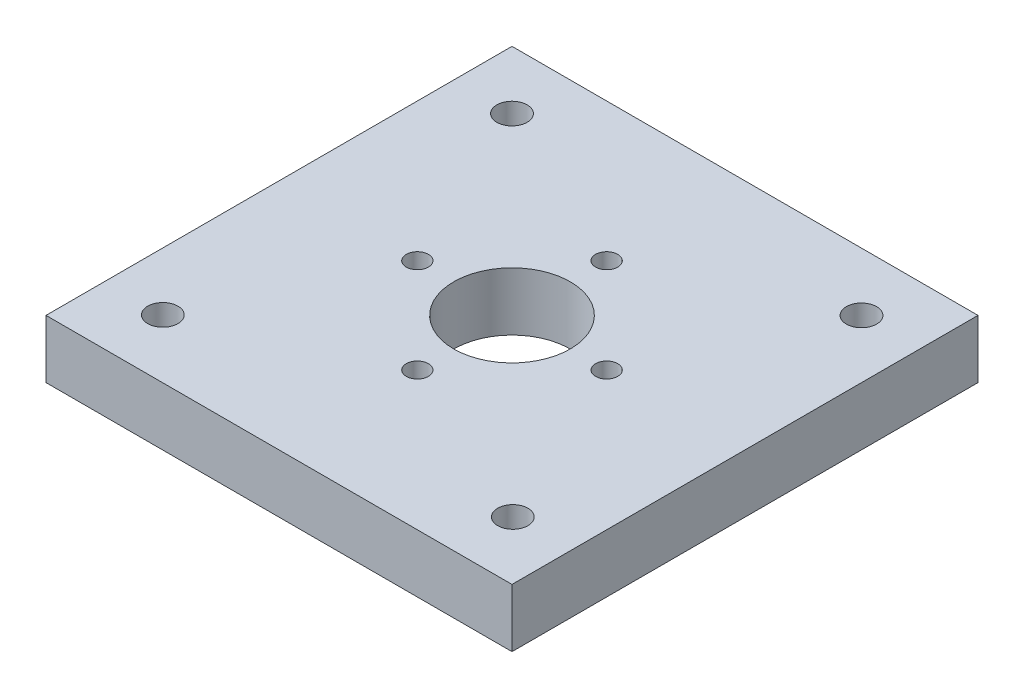
ISO-10303-21;
HEADER;
FILE_DESCRIPTION(('STEP AP214'),'2;1');
FILE_NAME('part.step','',(''),(''),'','','');
FILE_SCHEMA(('AUTOMOTIVE_DESIGN { 1 0 10303 214 1 1 1 1 }'));
ENDSEC;
DATA;
#1=APPLICATION_CONTEXT('core data for automotive mechanical design processes');
#2=APPLICATION_PROTOCOL_DEFINITION('international standard','automotive_design',2000,#1);
#3=PRODUCT_CONTEXT('',#1,'mechanical');
#4=PRODUCT('Part','Part','',(#3));
#5=PRODUCT_RELATED_PRODUCT_CATEGORY('part','',(#4));
#6=PRODUCT_DEFINITION_FORMATION('','',#4);
#7=PRODUCT_DEFINITION_CONTEXT('part definition',#1,'design');
#8=PRODUCT_DEFINITION('design','',#6,#7);
#9=PRODUCT_DEFINITION_SHAPE('','',#8);
#10=(LENGTH_UNIT() NAMED_UNIT(*) SI_UNIT(.MILLI.,.METRE.));
#11=(NAMED_UNIT(*) PLANE_ANGLE_UNIT() SI_UNIT($,.RADIAN.));
#12=(NAMED_UNIT(*) SI_UNIT($,.STERADIAN.) SOLID_ANGLE_UNIT());
#13=UNCERTAINTY_MEASURE_WITH_UNIT(LENGTH_MEASURE(1.E-05),#10,'distance_accuracy_value','');
#14=(GEOMETRIC_REPRESENTATION_CONTEXT(3) GLOBAL_UNCERTAINTY_ASSIGNED_CONTEXT((#13)) GLOBAL_UNIT_ASSIGNED_CONTEXT((#10,
#11,#12)) REPRESENTATION_CONTEXT('',''));
#15=CARTESIAN_POINT('',(0.,0.,0.));
#16=DIRECTION('',(0.,0.,1.));
#17=DIRECTION('',(1.,0.,0.));
#18=AXIS2_PLACEMENT_3D('',#15,#16,#17);
#19=CARTESIAN_POINT('',(0.,12.7,0.));
#20=DIRECTION('',(0.,1.,0.));
#21=DIRECTION('',(0.,0.,1.));
#22=AXIS2_PLACEMENT_3D('',#19,#20,#21);
#23=PLANE('',#22);
#24=CARTESIAN_POINT('',(5.84923411699841E-13,12.7,-20.6374999999994));
#25=DIRECTION('',(0.,1.,0.));
#26=DIRECTION('',(0.,0.,1.));
#27=AXIS2_PLACEMENT_3D('',#24,#25,#26);
#28=CIRCLE('',#27,2.41299999999961);
#29=CARTESIAN_POINT('',(5.84923411699841E-13,12.7,-18.2244999999998));
#30=VERTEX_POINT('',#29);
#31=EDGE_CURVE('E134',#30,#30,#28,.T.);
#32=ORIENTED_EDGE('',*,*,#31,.F.);
#33=EDGE_LOOP('',(#32));
#34=FACE_BOUND('',#33,.T.);
#35=CARTESIAN_POINT('',(20.6375000000006,12.7,5.85289345954093E-13));
#36=DIRECTION('',(0.,1.,0.));
#37=DIRECTION('',(0.,0.,1.));
#38=AXIS2_PLACEMENT_3D('',#35,#36,#37);
#39=CIRCLE('',#38,2.41299999999934);
#40=CARTESIAN_POINT('',(20.6375000000006,12.7,2.41299999999993));
#41=VERTEX_POINT('',#40);
#42=EDGE_CURVE('E263',#41,#41,#39,.T.);
#43=ORIENTED_EDGE('',*,*,#42,.F.);
#44=EDGE_LOOP('',(#43));
#45=FACE_BOUND('',#44,.T.);
#46=CARTESIAN_POINT('',(5.7986868203636E-13,12.7,20.6375000000006));
#47=DIRECTION('',(0.,1.,0.));
#48=DIRECTION('',(0.,0.,1.));
#49=AXIS2_PLACEMENT_3D('',#46,#47,#48);
#50=CIRCLE('',#49,2.41300000000052);
#51=CARTESIAN_POINT('',(5.7986868203636E-13,12.7,23.0505000000011));
#52=VERTEX_POINT('',#51);
#53=EDGE_CURVE('E267',#52,#52,#50,.T.);
#54=ORIENTED_EDGE('',*,*,#53,.F.);
#55=EDGE_LOOP('',(#54));
#56=FACE_BOUND('',#55,.T.);
#57=CARTESIAN_POINT('',(-20.6374999999994,12.7,5.85289345954092E-13));
#58=DIRECTION('',(0.,1.,0.));
#59=DIRECTION('',(0.,0.,1.));
#60=AXIS2_PLACEMENT_3D('',#57,#58,#59);
#61=CIRCLE('',#60,2.41300000000094);
#62=CARTESIAN_POINT('',(-20.6374999999994,12.7,2.41300000000152));
#63=VERTEX_POINT('',#62);
#64=EDGE_CURVE('E272',#63,#63,#61,.T.);
#65=ORIENTED_EDGE('',*,*,#64,.F.);
#66=EDGE_LOOP('',(#65));
#67=FACE_BOUND('',#66,.T.);
#68=CARTESIAN_POINT('',(0.,12.7,0.));
#69=DIRECTION('',(0.,1.,0.));
#70=DIRECTION('',(0.,0.,1.));
#71=AXIS2_PLACEMENT_3D('',#68,#69,#70);
#72=CIRCLE('',#71,12.7);
#73=CARTESIAN_POINT('',(0.,12.7,12.7));
#74=VERTEX_POINT('',#73);
#75=EDGE_CURVE('E144',#74,#74,#72,.T.);
#76=ORIENTED_EDGE('',*,*,#75,.F.);
#77=EDGE_LOOP('',(#76));
#78=FACE_BOUND('',#77,.T.);
#79=CARTESIAN_POINT('',(-38.1548462803196,12.7,37.9717700831118));
#80=DIRECTION('',(0.,-1.,0.));
#81=DIRECTION('',(0.,0.,-1.));
#82=AXIS2_PLACEMENT_3D('',#79,#80,#81);
#83=CIRCLE('',#82,3.302);
#84=CARTESIAN_POINT('',(-38.1548462803196,12.7,34.6697700831119));
#85=VERTEX_POINT('',#84);
#86=EDGE_CURVE('E168',#85,#85,#83,.T.);
#87=ORIENTED_EDGE('',*,*,#86,.T.);
#88=EDGE_LOOP('',(#87));
#89=FACE_BOUND('',#88,.T.);
#90=CARTESIAN_POINT('',(38.1548462803196,12.7,37.9717700831118));
#91=DIRECTION('',(0.,1.,0.));
#92=DIRECTION('',(0.,0.,1.));
#93=AXIS2_PLACEMENT_3D('',#90,#91,#92);
#94=CIRCLE('',#93,3.302);
#95=CARTESIAN_POINT('',(38.1548462803196,12.7,41.2737700831118));
#96=VERTEX_POINT('',#95);
#97=EDGE_CURVE('E159',#96,#96,#94,.T.);
#98=ORIENTED_EDGE('',*,*,#97,.F.);
#99=EDGE_LOOP('',(#98));
#100=FACE_BOUND('',#99,.T.);
#101=CARTESIAN_POINT('',(-38.1,12.7,-38.1));
#102=DIRECTION('',(0.,1.,0.));
#103=DIRECTION('',(0.,0.,1.));
#104=AXIS2_PLACEMENT_3D('',#101,#102,#103);
#105=CIRCLE('',#104,3.302);
#106=CARTESIAN_POINT('',(-38.1,12.7,-34.798));
#107=VERTEX_POINT('',#106);
#108=EDGE_CURVE('E163',#107,#107,#105,.T.);
#109=ORIENTED_EDGE('',*,*,#108,.F.);
#110=EDGE_LOOP('',(#109));
#111=FACE_BOUND('',#110,.T.);
#112=DIRECTION('',(0.,0.,-1.));
#113=VECTOR('',#112,1.);
#114=CARTESIAN_POINT('',(50.8,12.7,-50.8));
#115=LINE('',#114,#113);
#116=CARTESIAN_POINT('',(50.8,12.7,50.8));
#117=VERTEX_POINT('',#116);
#118=CARTESIAN_POINT('',(50.8,12.7,-50.8));
#119=VERTEX_POINT('',#118);
#120=EDGE_CURVE('E97',#117,#119,#115,.T.);
#121=ORIENTED_EDGE('',*,*,#120,.T.);
#122=DIRECTION('',(-1.,0.,0.));
#123=VECTOR('',#122,1.);
#124=CARTESIAN_POINT('',(-50.8,12.7,-50.8));
#125=LINE('',#124,#123);
#126=CARTESIAN_POINT('',(-50.8,12.7,-50.8));
#127=VERTEX_POINT('',#126);
#128=EDGE_CURVE('E92',#119,#127,#125,.T.);
#129=ORIENTED_EDGE('',*,*,#128,.T.);
#130=DIRECTION('',(0.,0.,1.));
#131=VECTOR('',#130,1.);
#132=CARTESIAN_POINT('',(-50.8,12.7,-50.8));
#133=LINE('',#132,#131);
#134=CARTESIAN_POINT('',(-50.8,12.7,50.8));
#135=VERTEX_POINT('',#134);
#136=EDGE_CURVE('E95',#127,#135,#133,.T.);
#137=ORIENTED_EDGE('',*,*,#136,.T.);
#138=DIRECTION('',(1.,0.,0.));
#139=VECTOR('',#138,1.);
#140=CARTESIAN_POINT('',(-50.8,12.7,50.8));
#141=LINE('',#140,#139);
#142=EDGE_CURVE('E62',#135,#117,#141,.T.);
#143=ORIENTED_EDGE('',*,*,#142,.T.);
#144=EDGE_LOOP('',(#121,#129,#137,#143));
#145=FACE_BOUND('',#144,.T.);
#146=CARTESIAN_POINT('',(38.1,12.7,-38.0999999999999));
#147=DIRECTION('',(0.,-1.,0.));
#148=DIRECTION('',(0.,0.,-1.));
#149=AXIS2_PLACEMENT_3D('',#146,#147,#148);
#150=CIRCLE('',#149,3.302);
#151=CARTESIAN_POINT('',(38.1,12.7,-41.4019999999999));
#152=VERTEX_POINT('',#151);
#153=EDGE_CURVE('E176',#152,#152,#150,.T.);
#154=ORIENTED_EDGE('',*,*,#153,.T.);
#155=EDGE_LOOP('',(#154));
#156=FACE_BOUND('',#155,.T.);
#157=ADVANCED_FACE('F42',(#34,#45,#56,#67,#78,#89,#100,#111,#145,#156),#23,.T.);
#158=CARTESIAN_POINT('',(0.,0.,0.));
#159=DIRECTION('',(0.,1.,0.));
#160=DIRECTION('',(0.,0.,1.));
#161=AXIS2_PLACEMENT_3D('',#158,#159,#160);
#162=PLANE('',#161);
#163=CARTESIAN_POINT('',(5.84923411699841E-13,0.,-20.6374999999994));
#164=DIRECTION('',(0.,1.,0.));
#165=DIRECTION('',(0.,0.,1.));
#166=AXIS2_PLACEMENT_3D('',#163,#164,#165);
#167=CIRCLE('',#166,2.41299999999961);
#168=CARTESIAN_POINT('',(5.84923411699841E-13,0.,-18.2244999999998));
#169=VERTEX_POINT('',#168);
#170=EDGE_CURVE('E46',#169,#169,#167,.T.);
#171=ORIENTED_EDGE('',*,*,#170,.T.);
#172=EDGE_LOOP('',(#171));
#173=FACE_BOUND('',#172,.T.);
#174=CARTESIAN_POINT('',(20.6375000000006,0.,5.85289345954093E-13));
#175=DIRECTION('',(0.,1.,0.));
#176=DIRECTION('',(0.,0.,1.));
#177=AXIS2_PLACEMENT_3D('',#174,#175,#176);
#178=CIRCLE('',#177,2.41299999999934);
#179=CARTESIAN_POINT('',(20.6375000000006,0.,2.41299999999993));
#180=VERTEX_POINT('',#179);
#181=EDGE_CURVE('E137',#180,#180,#178,.T.);
#182=ORIENTED_EDGE('',*,*,#181,.T.);
#183=EDGE_LOOP('',(#182));
#184=FACE_BOUND('',#183,.T.);
#185=CARTESIAN_POINT('',(5.7986868203636E-13,0.,20.6375000000006));
#186=DIRECTION('',(0.,1.,0.));
#187=DIRECTION('',(0.,0.,1.));
#188=AXIS2_PLACEMENT_3D('',#185,#186,#187);
#189=CIRCLE('',#188,2.41300000000052);
#190=CARTESIAN_POINT('',(5.7986868203636E-13,0.,23.0505000000011));
#191=VERTEX_POINT('',#190);
#192=EDGE_CURVE('E133',#191,#191,#189,.T.);
#193=ORIENTED_EDGE('',*,*,#192,.T.);
#194=EDGE_LOOP('',(#193));
#195=FACE_BOUND('',#194,.T.);
#196=CARTESIAN_POINT('',(-20.6374999999994,0.,5.85289345954092E-13));
#197=DIRECTION('',(0.,1.,0.));
#198=DIRECTION('',(0.,0.,1.));
#199=AXIS2_PLACEMENT_3D('',#196,#197,#198);
#200=CIRCLE('',#199,2.41300000000094);
#201=CARTESIAN_POINT('',(-20.6374999999994,0.,2.41300000000152));
#202=VERTEX_POINT('',#201);
#203=EDGE_CURVE('E129',#202,#202,#200,.T.);
#204=ORIENTED_EDGE('',*,*,#203,.T.);
#205=EDGE_LOOP('',(#204));
#206=FACE_BOUND('',#205,.T.);
#207=CARTESIAN_POINT('',(0.,0.,0.));
#208=DIRECTION('',(0.,1.,0.));
#209=DIRECTION('',(0.,0.,1.));
#210=AXIS2_PLACEMENT_3D('',#207,#208,#209);
#211=CIRCLE('',#210,12.7);
#212=CARTESIAN_POINT('',(0.,0.,12.7));
#213=VERTEX_POINT('',#212);
#214=EDGE_CURVE('E149',#213,#213,#211,.T.);
#215=ORIENTED_EDGE('',*,*,#214,.T.);
#216=EDGE_LOOP('',(#215));
#217=FACE_BOUND('',#216,.T.);
#218=CARTESIAN_POINT('',(38.1548462803196,0.,37.9717700831118));
#219=DIRECTION('',(0.,1.,0.));
#220=DIRECTION('',(0.,0.,1.));
#221=AXIS2_PLACEMENT_3D('',#218,#219,#220);
#222=CIRCLE('',#221,3.302);
#223=CARTESIAN_POINT('',(38.1548462803196,0.,41.2737700831118));
#224=VERTEX_POINT('',#223);
#225=EDGE_CURVE('E164',#224,#224,#222,.T.);
#226=ORIENTED_EDGE('',*,*,#225,.T.);
#227=EDGE_LOOP('',(#226));
#228=FACE_BOUND('',#227,.T.);
#229=CARTESIAN_POINT('',(-38.1,0.,-38.1));
#230=DIRECTION('',(0.,1.,0.));
#231=DIRECTION('',(0.,0.,1.));
#232=AXIS2_PLACEMENT_3D('',#229,#230,#231);
#233=CIRCLE('',#232,3.302);
#234=CARTESIAN_POINT('',(-38.1,0.,-34.798));
#235=VERTEX_POINT('',#234);
#236=EDGE_CURVE('E118',#235,#235,#233,.T.);
#237=ORIENTED_EDGE('',*,*,#236,.T.);
#238=EDGE_LOOP('',(#237));
#239=FACE_BOUND('',#238,.T.);
#240=DIRECTION('',(0.,0.,-1.));
#241=VECTOR('',#240,1.);
#242=CARTESIAN_POINT('',(50.8,0.,-50.8));
#243=LINE('',#242,#241);
#244=CARTESIAN_POINT('',(50.8,0.,50.8));
#245=VERTEX_POINT('',#244);
#246=CARTESIAN_POINT('',(50.8,0.,-50.8));
#247=VERTEX_POINT('',#246);
#248=EDGE_CURVE('E114',#245,#247,#243,.T.);
#249=ORIENTED_EDGE('',*,*,#248,.F.);
#250=DIRECTION('',(1.,0.,0.));
#251=VECTOR('',#250,1.);
#252=CARTESIAN_POINT('',(-50.8,0.,50.8));
#253=LINE('',#252,#251);
#254=CARTESIAN_POINT('',(-50.8,0.,50.8));
#255=VERTEX_POINT('',#254);
#256=EDGE_CURVE('E85',#255,#245,#253,.T.);
#257=ORIENTED_EDGE('',*,*,#256,.F.);
#258=DIRECTION('',(0.,0.,1.));
#259=VECTOR('',#258,1.);
#260=CARTESIAN_POINT('',(-50.8,0.,-50.8));
#261=LINE('',#260,#259);
#262=CARTESIAN_POINT('',(-50.8,0.,-50.8));
#263=VERTEX_POINT('',#262);
#264=EDGE_CURVE('E79',#263,#255,#261,.T.);
#265=ORIENTED_EDGE('',*,*,#264,.F.);
#266=DIRECTION('',(-1.,0.,0.));
#267=VECTOR('',#266,1.);
#268=CARTESIAN_POINT('',(-50.8,0.,-50.8));
#269=LINE('',#268,#267);
#270=EDGE_CURVE('E102',#247,#263,#269,.T.);
#271=ORIENTED_EDGE('',*,*,#270,.F.);
#272=EDGE_LOOP('',(#249,#257,#265,#271));
#273=FACE_BOUND('',#272,.T.);
#274=CARTESIAN_POINT('',(-38.1548462803196,0.,37.9717700831118));
#275=DIRECTION('',(0.,-1.,0.));
#276=DIRECTION('',(0.,0.,-1.));
#277=AXIS2_PLACEMENT_3D('',#274,#275,#276);
#278=CIRCLE('',#277,3.302);
#279=CARTESIAN_POINT('',(-38.1548462803196,0.,34.6697700831119));
#280=VERTEX_POINT('',#279);
#281=EDGE_CURVE('E172',#280,#280,#278,.T.);
#282=ORIENTED_EDGE('',*,*,#281,.F.);
#283=EDGE_LOOP('',(#282));
#284=FACE_BOUND('',#283,.T.);
#285=CARTESIAN_POINT('',(38.1,0.,-38.0999999999999));
#286=DIRECTION('',(0.,-1.,0.));
#287=DIRECTION('',(0.,0.,-1.));
#288=AXIS2_PLACEMENT_3D('',#285,#286,#287);
#289=CIRCLE('',#288,3.302);
#290=CARTESIAN_POINT('',(38.1,0.,-41.4019999999999));
#291=VERTEX_POINT('',#290);
#292=EDGE_CURVE('E155',#291,#291,#289,.T.);
#293=ORIENTED_EDGE('',*,*,#292,.F.);
#294=EDGE_LOOP('',(#293));
#295=FACE_BOUND('',#294,.T.);
#296=ADVANCED_FACE('F194',(#173,#184,#195,#206,#217,#228,#239,#273,#284,#295),#162,.F.);
#297=CARTESIAN_POINT('',(50.8,12.7,-50.8));
#298=DIRECTION('',(-1.,0.,0.));
#299=DIRECTION('',(0.,0.,1.));
#300=AXIS2_PLACEMENT_3D('',#297,#298,#299);
#301=PLANE('',#300);
#302=ORIENTED_EDGE('',*,*,#248,.T.);
#303=DIRECTION('',(0.,-1.,0.));
#304=VECTOR('',#303,1.);
#305=CARTESIAN_POINT('',(50.8,12.7,-50.8));
#306=LINE('',#305,#304);
#307=EDGE_CURVE('E11',#119,#247,#306,.T.);
#308=ORIENTED_EDGE('',*,*,#307,.F.);
#309=ORIENTED_EDGE('',*,*,#120,.F.);
#310=DIRECTION('',(0.,-1.,0.));
#311=VECTOR('',#310,1.);
#312=CARTESIAN_POINT('',(50.8,12.7,50.8));
#313=LINE('',#312,#311);
#314=EDGE_CURVE('E110',#117,#245,#313,.T.);
#315=ORIENTED_EDGE('',*,*,#314,.T.);
#316=EDGE_LOOP('',(#302,#308,#309,#315));
#317=FACE_BOUND('',#316,.T.);
#318=ADVANCED_FACE('F44',(#317),#301,.F.);
#319=CARTESIAN_POINT('',(-50.8,12.7,-50.8));
#320=DIRECTION('',(0.,0.,1.));
#321=DIRECTION('',(1.,0.,0.));
#322=AXIS2_PLACEMENT_3D('',#319,#320,#321);
#323=PLANE('',#322);
#324=ORIENTED_EDGE('',*,*,#270,.T.);
#325=DIRECTION('',(0.,-1.,0.));
#326=VECTOR('',#325,1.);
#327=CARTESIAN_POINT('',(-50.8,12.7,-50.8));
#328=LINE('',#327,#326);
#329=EDGE_CURVE('E53',#127,#263,#328,.T.);
#330=ORIENTED_EDGE('',*,*,#329,.F.);
#331=ORIENTED_EDGE('',*,*,#128,.F.);
#332=ORIENTED_EDGE('',*,*,#307,.T.);
#333=EDGE_LOOP('',(#324,#330,#331,#332));
#334=FACE_BOUND('',#333,.T.);
#335=ADVANCED_FACE('F101',(#334),#323,.F.);
#336=CARTESIAN_POINT('',(-50.8,12.7,-50.8));
#337=DIRECTION('',(1.,0.,0.));
#338=DIRECTION('',(0.,0.,-1.));
#339=AXIS2_PLACEMENT_3D('',#336,#337,#338);
#340=PLANE('',#339);
#341=ORIENTED_EDGE('',*,*,#264,.T.);
#342=DIRECTION('',(0.,-1.,0.));
#343=VECTOR('',#342,1.);
#344=CARTESIAN_POINT('',(-50.8,12.7,50.8));
#345=LINE('',#344,#343);
#346=EDGE_CURVE('E104',#135,#255,#345,.T.);
#347=ORIENTED_EDGE('',*,*,#346,.F.);
#348=ORIENTED_EDGE('',*,*,#136,.F.);
#349=ORIENTED_EDGE('',*,*,#329,.T.);
#350=EDGE_LOOP('',(#341,#347,#348,#349));
#351=FACE_BOUND('',#350,.T.);
#352=ADVANCED_FACE('F106',(#351),#340,.F.);
#353=CARTESIAN_POINT('',(-50.8,12.7,50.8));
#354=DIRECTION('',(0.,0.,-1.));
#355=DIRECTION('',(-1.,0.,0.));
#356=AXIS2_PLACEMENT_3D('',#353,#354,#355);
#357=PLANE('',#356);
#358=ORIENTED_EDGE('',*,*,#256,.T.);
#359=ORIENTED_EDGE('',*,*,#314,.F.);
#360=ORIENTED_EDGE('',*,*,#142,.F.);
#361=ORIENTED_EDGE('',*,*,#346,.T.);
#362=EDGE_LOOP('',(#358,#359,#360,#361));
#363=FACE_BOUND('',#362,.T.);
#364=ADVANCED_FACE('F206',(#363),#357,.F.);
#365=CARTESIAN_POINT('',(-38.1,0.,-38.1));
#366=DIRECTION('',(0.,1.,0.));
#367=DIRECTION('',(0.,0.,1.));
#368=AXIS2_PLACEMENT_3D('',#365,#366,#367);
#369=CYLINDRICAL_SURFACE('',#368,3.302);
#370=ORIENTED_EDGE('',*,*,#236,.F.);
#371=EDGE_LOOP('',(#370));
#372=FACE_BOUND('',#371,.T.);
#373=ORIENTED_EDGE('',*,*,#108,.T.);
#374=EDGE_LOOP('',(#373));
#375=FACE_BOUND('',#374,.T.);
#376=ADVANCED_FACE('F191',(#372,#375),#369,.F.);
#377=CARTESIAN_POINT('',(38.1548462803196,0.,37.9717700831118));
#378=DIRECTION('',(0.,1.,0.));
#379=DIRECTION('',(0.,0.,1.));
#380=AXIS2_PLACEMENT_3D('',#377,#378,#379);
#381=CYLINDRICAL_SURFACE('',#380,3.302);
#382=ORIENTED_EDGE('',*,*,#225,.F.);
#383=EDGE_LOOP('',(#382));
#384=FACE_BOUND('',#383,.T.);
#385=ORIENTED_EDGE('',*,*,#97,.T.);
#386=EDGE_LOOP('',(#385));
#387=FACE_BOUND('',#386,.T.);
#388=ADVANCED_FACE('F237',(#384,#387),#381,.F.);
#389=CARTESIAN_POINT('',(-38.1548462803196,0.,37.9717700831118));
#390=DIRECTION('',(0.,1.,0.));
#391=DIRECTION('',(0.,0.,1.));
#392=AXIS2_PLACEMENT_3D('',#389,#390,#391);
#393=CYLINDRICAL_SURFACE('',#392,3.302);
#394=ORIENTED_EDGE('',*,*,#281,.T.);
#395=EDGE_LOOP('',(#394));
#396=FACE_BOUND('',#395,.T.);
#397=ORIENTED_EDGE('',*,*,#86,.F.);
#398=EDGE_LOOP('',(#397));
#399=FACE_BOUND('',#398,.T.);
#400=ADVANCED_FACE('F228',(#396,#399),#393,.F.);
#401=CARTESIAN_POINT('',(38.1,0.,-38.0999999999999));
#402=DIRECTION('',(0.,1.,0.));
#403=DIRECTION('',(0.,0.,1.));
#404=AXIS2_PLACEMENT_3D('',#401,#402,#403);
#405=CYLINDRICAL_SURFACE('',#404,3.302);
#406=ORIENTED_EDGE('',*,*,#292,.T.);
#407=EDGE_LOOP('',(#406));
#408=FACE_BOUND('',#407,.T.);
#409=ORIENTED_EDGE('',*,*,#153,.F.);
#410=EDGE_LOOP('',(#409));
#411=FACE_BOUND('',#410,.T.);
#412=ADVANCED_FACE('F224',(#408,#411),#405,.F.);
#413=CARTESIAN_POINT('',(0.,0.,0.));
#414=DIRECTION('',(0.,1.,0.));
#415=DIRECTION('',(0.,0.,1.));
#416=AXIS2_PLACEMENT_3D('',#413,#414,#415);
#417=CYLINDRICAL_SURFACE('',#416,12.7);
#418=ORIENTED_EDGE('',*,*,#214,.F.);
#419=EDGE_LOOP('',(#418));
#420=FACE_BOUND('',#419,.T.);
#421=ORIENTED_EDGE('',*,*,#75,.T.);
#422=EDGE_LOOP('',(#421));
#423=FACE_BOUND('',#422,.T.);
#424=ADVANCED_FACE('F227',(#420,#423),#417,.F.);
#425=CARTESIAN_POINT('',(-20.6374999999994,-50.8,5.85289345954092E-13));
#426=DIRECTION('',(0.,1.,0.));
#427=DIRECTION('',(0.,0.,1.));
#428=AXIS2_PLACEMENT_3D('',#425,#426,#427);
#429=CYLINDRICAL_SURFACE('',#428,2.41300000000094);
#430=ORIENTED_EDGE('',*,*,#64,.T.);
#431=EDGE_LOOP('',(#430));
#432=FACE_BOUND('',#431,.T.);
#433=ORIENTED_EDGE('',*,*,#203,.F.);
#434=EDGE_LOOP('',(#433));
#435=FACE_BOUND('',#434,.T.);
#436=ADVANCED_FACE('F234',(#432,#435),#429,.F.);
#437=CARTESIAN_POINT('',(5.7986868203636E-13,-50.8,20.6375000000006));
#438=DIRECTION('',(0.,1.,0.));
#439=DIRECTION('',(0.,0.,1.));
#440=AXIS2_PLACEMENT_3D('',#437,#438,#439);
#441=CYLINDRICAL_SURFACE('',#440,2.41300000000052);
#442=ORIENTED_EDGE('',*,*,#53,.T.);
#443=EDGE_LOOP('',(#442));
#444=FACE_BOUND('',#443,.T.);
#445=ORIENTED_EDGE('',*,*,#192,.F.);
#446=EDGE_LOOP('',(#445));
#447=FACE_BOUND('',#446,.T.);
#448=ADVANCED_FACE('F246',(#444,#447),#441,.F.);
#449=CARTESIAN_POINT('',(20.6375000000006,-50.8,5.85289345954093E-13));
#450=DIRECTION('',(0.,1.,0.));
#451=DIRECTION('',(0.,0.,1.));
#452=AXIS2_PLACEMENT_3D('',#449,#450,#451);
#453=CYLINDRICAL_SURFACE('',#452,2.41299999999934);
#454=ORIENTED_EDGE('',*,*,#42,.T.);
#455=EDGE_LOOP('',(#454));
#456=FACE_BOUND('',#455,.T.);
#457=ORIENTED_EDGE('',*,*,#181,.F.);
#458=EDGE_LOOP('',(#457));
#459=FACE_BOUND('',#458,.T.);
#460=ADVANCED_FACE('F250',(#456,#459),#453,.F.);
#461=CARTESIAN_POINT('',(5.84923411699841E-13,-50.8,-20.6374999999994));
#462=DIRECTION('',(0.,1.,0.));
#463=DIRECTION('',(0.,0.,1.));
#464=AXIS2_PLACEMENT_3D('',#461,#462,#463);
#465=CYLINDRICAL_SURFACE('',#464,2.41299999999961);
#466=ORIENTED_EDGE('',*,*,#31,.T.);
#467=EDGE_LOOP('',(#466));
#468=FACE_BOUND('',#467,.T.);
#469=ORIENTED_EDGE('',*,*,#170,.F.);
#470=EDGE_LOOP('',(#469));
#471=FACE_BOUND('',#470,.T.);
#472=ADVANCED_FACE('F254',(#468,#471),#465,.F.);
#473=CLOSED_SHELL('',(#157,#296,#318,#335,#352,#364,#376,#388,#400,#412,#424,#436,#448,#460,#472));
#474=MANIFOLD_SOLID_BREP('B2',#473);
#475=ADVANCED_BREP_SHAPE_REPRESENTATION('',(#18,#474),#14);
#476=SHAPE_DEFINITION_REPRESENTATION(#9,#475);
ENDSEC;
END-ISO-10303-21;
